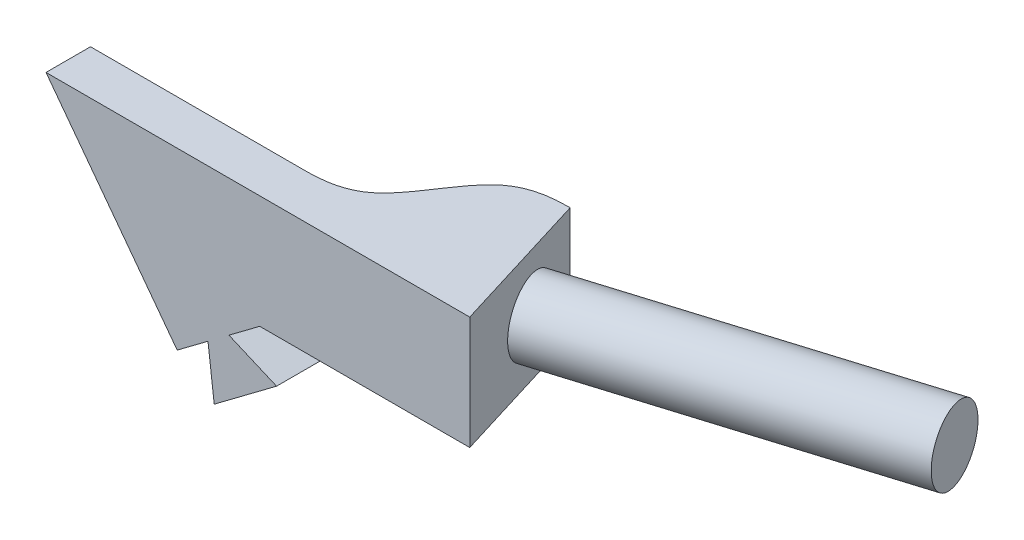
ISO-10303-21;
HEADER;
FILE_DESCRIPTION(('STEP AP214'),'2;1');
FILE_NAME('part.step','',(''),(''),'','','');
FILE_SCHEMA(('AUTOMOTIVE_DESIGN { 1 0 10303 214 1 1 1 1 }'));
ENDSEC;
DATA;
#1=APPLICATION_CONTEXT('core data for automotive mechanical design processes');
#2=APPLICATION_PROTOCOL_DEFINITION('international standard','automotive_design',2000,#1);
#3=PRODUCT_CONTEXT('',#1,'mechanical');
#4=PRODUCT('Part','Part','',(#3));
#5=PRODUCT_RELATED_PRODUCT_CATEGORY('part','',(#4));
#6=PRODUCT_DEFINITION_FORMATION('','',#4);
#7=PRODUCT_DEFINITION_CONTEXT('part definition',#1,'design');
#8=PRODUCT_DEFINITION('design','',#6,#7);
#9=PRODUCT_DEFINITION_SHAPE('','',#8);
#10=(LENGTH_UNIT() NAMED_UNIT(*) SI_UNIT(.MILLI.,.METRE.));
#11=(NAMED_UNIT(*) PLANE_ANGLE_UNIT() SI_UNIT($,.RADIAN.));
#12=(NAMED_UNIT(*) SI_UNIT($,.STERADIAN.) SOLID_ANGLE_UNIT());
#13=UNCERTAINTY_MEASURE_WITH_UNIT(LENGTH_MEASURE(1.E-05),#10,'distance_accuracy_value','');
#14=(GEOMETRIC_REPRESENTATION_CONTEXT(3) GLOBAL_UNCERTAINTY_ASSIGNED_CONTEXT((#13)) GLOBAL_UNIT_ASSIGNED_CONTEXT((#10,
#11,#12)) REPRESENTATION_CONTEXT('',''));
#15=CARTESIAN_POINT('',(0.,0.,0.));
#16=DIRECTION('',(0.,0.,1.));
#17=DIRECTION('',(1.,0.,0.));
#18=AXIS2_PLACEMENT_3D('',#15,#16,#17);
#19=CARTESIAN_POINT('',(-38.1,-12.7,-19.878167));
#20=DIRECTION('',(0.,-1.,0.));
#21=DIRECTION('',(0.,0.,-1.));
#22=AXIS2_PLACEMENT_3D('',#19,#20,#21);
#23=PLANE('',#22);
#24=DIRECTION('',(1.,0.,0.));
#25=VECTOR('',#24,1.);
#26=CARTESIAN_POINT('',(-38.1,-12.7,12.7));
#27=LINE('',#26,#25);
#28=CARTESIAN_POINT('',(-9.10564613460168,-12.7,12.7));
#29=VERTEX_POINT('',#28);
#30=CARTESIAN_POINT('',(38.1,-12.7,12.7));
#31=VERTEX_POINT('',#30);
#32=EDGE_CURVE('E91',#29,#31,#27,.T.);
#33=ORIENTED_EDGE('',*,*,#32,.F.);
#34=DIRECTION('',(0.,0.,-1.));
#35=VECTOR('',#34,1.);
#36=CARTESIAN_POINT('',(-9.10564613460168,-12.7,44.8615757491108));
#37=LINE('',#36,#35);
#38=CARTESIAN_POINT('',(-9.10564613460168,-12.7,2.7));
#39=VERTEX_POINT('',#38);
#40=EDGE_CURVE('E199',#29,#39,#37,.T.);
#41=ORIENTED_EDGE('',*,*,#40,.T.);
#42=CARTESIAN_POINT('',(28.0956449744943,-12.7,-19.878167));
#43=CARTESIAN_POINT('',(23.2624762333461,-12.7,-19.878167));
#44=CARTESIAN_POINT('',(13.7597257234162,-12.7,-18.3882704900342));
#45=CARTESIAN_POINT('',(5.19295176017359,-12.7,1.21010349003423));
#46=CARTESIAN_POINT('',(-4.18514201423127,-12.7,2.7));
#47=CARTESIAN_POINT('',(-9.1056461346017,-12.7,2.7));
#48=B_SPLINE_CURVE_WITH_KNOTS('',3,(#42,#43,#44,#45,#46,#47),.UNSPECIFIED.,.F.,.F.,(4,1,1,4),
(0.,0.311689084079751,0.688310915920249,1.),.UNSPECIFIED.);
#49=CARTESIAN_POINT('',(28.0956449744943,-12.7,-19.878167));
#50=VERTEX_POINT('',#49);
#51=EDGE_CURVE('E239',#50,#39,#48,.T.);
#52=ORIENTED_EDGE('',*,*,#51,.F.);
#53=DIRECTION('',(0.29355783850351,0.,0.95594131381228));
#54=VECTOR('',#53,1.);
#55=CARTESIAN_POINT('',(31.2527609708644,-12.7,-9.59733910995651));
#56=LINE('',#55,#54);
#57=EDGE_CURVE('E106',#50,#31,#56,.T.);
#58=ORIENTED_EDGE('',*,*,#57,.T.);
#59=EDGE_LOOP('',(#33,#41,#52,#58));
#60=FACE_BOUND('',#59,.T.);
#61=ADVANCED_FACE('F87',(#60),#23,.T.);
#62=CARTESIAN_POINT('',(-38.1,12.7,-19.878167));
#63=DIRECTION('',(0.,1.,0.));
#64=DIRECTION('',(0.,0.,1.));
#65=AXIS2_PLACEMENT_3D('',#62,#63,#64);
#66=PLANE('',#65);
#67=DIRECTION('',(-1.,0.,0.));
#68=VECTOR('',#67,1.);
#69=CARTESIAN_POINT('',(-38.1,12.7,12.7));
#70=LINE('',#69,#68);
#71=CARTESIAN_POINT('',(38.1,12.7,12.7));
#72=VERTEX_POINT('',#71);
#73=CARTESIAN_POINT('',(-57.1506044956256,12.7,12.7));
#74=VERTEX_POINT('',#73);
#75=EDGE_CURVE('E282',#72,#74,#70,.T.);
#76=ORIENTED_EDGE('',*,*,#75,.F.);
#77=DIRECTION('',(0.29355783850351,0.,0.95594131381228));
#78=VECTOR('',#77,1.);
#79=CARTESIAN_POINT('',(31.2527609708644,12.7,-9.59733910995651));
#80=LINE('',#79,#78);
#81=CARTESIAN_POINT('',(28.0956449744943,12.7,-19.878167));
#82=VERTEX_POINT('',#81);
#83=EDGE_CURVE('E235',#82,#72,#80,.T.);
#84=ORIENTED_EDGE('',*,*,#83,.F.);
#85=CARTESIAN_POINT('',(28.0956449744943,12.7,-19.878167));
#86=CARTESIAN_POINT('',(23.2624762333461,12.7,-19.878167));
#87=CARTESIAN_POINT('',(13.7597257234162,12.7,-18.3882704900342));
#88=CARTESIAN_POINT('',(5.19295176017359,12.7,1.21010349003423));
#89=CARTESIAN_POINT('',(-4.18514201423127,12.7,2.7));
#90=CARTESIAN_POINT('',(-9.1056461346017,12.7,2.7));
#91=B_SPLINE_CURVE_WITH_KNOTS('',3,(#85,#86,#87,#88,#89,#90),.UNSPECIFIED.,.F.,.F.,(4,1,1,4),
(0.,0.311689084079751,0.688310915920249,1.),.UNSPECIFIED.);
#92=CARTESIAN_POINT('',(-9.10564613460168,12.7,2.7));
#93=VERTEX_POINT('',#92);
#94=EDGE_CURVE('E247',#82,#93,#91,.T.);
#95=ORIENTED_EDGE('',*,*,#94,.T.);
#96=DIRECTION('',(-1.,0.,0.));
#97=VECTOR('',#96,1.);
#98=CARTESIAN_POINT('',(-9.10564613460168,12.7,2.7));
#99=LINE('',#98,#97);
#100=CARTESIAN_POINT('',(-57.1506044956256,12.7,2.69999999999999));
#101=VERTEX_POINT('',#100);
#102=EDGE_CURVE('E254',#93,#101,#99,.T.);
#103=ORIENTED_EDGE('',*,*,#102,.T.);
#104=DIRECTION('',(0.,0.,-1.));
#105=VECTOR('',#104,1.);
#106=CARTESIAN_POINT('',(-57.1506044956256,12.7,44.8615757491108));
#107=LINE('',#106,#105);
#108=EDGE_CURVE('E167',#74,#101,#107,.T.);
#109=ORIENTED_EDGE('',*,*,#108,.F.);
#110=EDGE_LOOP('',(#76,#84,#95,#103,#109));
#111=FACE_BOUND('',#110,.T.);
#112=ADVANCED_FACE('F89',(#111),#66,.T.);
#113=CARTESIAN_POINT('',(0.,0.,12.7));
#114=DIRECTION('',(0.,0.,-1.));
#115=DIRECTION('',(-1.,0.,0.));
#116=AXIS2_PLACEMENT_3D('',#113,#114,#115);
#117=PLANE('',#116);
#118=DIRECTION('',(0.,1.,0.));
#119=VECTOR('',#118,1.);
#120=CARTESIAN_POINT('',(38.1,-12.7,12.7));
#121=LINE('',#120,#119);
#122=EDGE_CURVE('E245',#31,#72,#121,.T.);
#123=ORIENTED_EDGE('',*,*,#122,.T.);
#124=ORIENTED_EDGE('',*,*,#75,.T.);
#125=DIRECTION('',(0.60001218489988,-0.799990861180097,0.));
#126=VECTOR('',#125,1.);
#127=CARTESIAN_POINT('',(-30.4794970600816,-22.8603481778424,12.7));
#128=LINE('',#127,#126);
#129=CARTESIAN_POINT('',(-27.6616086521931,-26.6174135022947,12.7));
#130=VERTEX_POINT('',#129);
#131=EDGE_CURVE('E227',#74,#130,#128,.T.);
#132=ORIENTED_EDGE('',*,*,#131,.T.);
#133=DIRECTION('',(0.799990861180097,0.60001218489988,0.));
#134=VECTOR('',#133,1.);
#135=CARTESIAN_POINT('',(2.81788840788857,-3.75706532445229,12.7));
#136=LINE('',#135,#134);
#137=CARTESIAN_POINT('',(-20.7364927995103,-21.4234118016709,12.7));
#138=VERTEX_POINT('',#137);
#139=EDGE_CURVE('E183',#130,#138,#136,.T.);
#140=ORIENTED_EDGE('',*,*,#139,.T.);
#141=DIRECTION('',(0.119630364113448,-0.992818501027295,0.));
#142=VECTOR('',#141,1.);
#143=CARTESIAN_POINT('',(-19.3435444398251,-32.9835613733929,12.7));
#144=LINE('',#143,#142);
#145=CARTESIAN_POINT('',(-19.3435444398251,-32.9835613733929,12.7));
#146=VERTEX_POINT('',#145);
#147=EDGE_CURVE('E200',#138,#146,#144,.T.);
#148=ORIENTED_EDGE('',*,*,#147,.T.);
#149=DIRECTION('',(0.799990861180097,0.600012184899879,0.));
#150=VECTOR('',#149,1.);
#151=CARTESIAN_POINT('',(-5.32290460678278,-22.4677478208376,12.7));
#152=LINE('',#151,#150);
#153=CARTESIAN_POINT('',(-5.32290460678277,-22.4677478208376,12.7));
#154=VERTEX_POINT('',#153);
#155=EDGE_CURVE('E203',#146,#154,#152,.T.);
#156=ORIENTED_EDGE('',*,*,#155,.T.);
#157=DIRECTION('',(-0.919621225293552,0.39280631612741,0.));
#158=VECTOR('',#157,1.);
#159=CARTESIAN_POINT('',(-16.0307619872844,-17.8940017006239,12.7));
#160=LINE('',#159,#158);
#161=CARTESIAN_POINT('',(-16.0307619872844,-17.8940017006239,12.7));
#162=VERTEX_POINT('',#161);
#163=EDGE_CURVE('E204',#154,#162,#160,.T.);
#164=ORIENTED_EDGE('',*,*,#163,.T.);
#165=EDGE_CURVE('E208',#162,#29,#136,.T.);
#166=ORIENTED_EDGE('',*,*,#165,.T.);
#167=ORIENTED_EDGE('',*,*,#32,.T.);
#168=EDGE_LOOP('',(#123,#124,#132,#140,#148,#156,#164,#166,#167));
#169=FACE_BOUND('',#168,.T.);
#170=ADVANCED_FACE('F264',(#169),#117,.F.);
#171=DIRECTION('',(0.,-1.,0.));
#172=VECTOR('',#171,1.);
#173=SURFACE_OF_LINEAR_EXTRUSION('',#91,#172);
#174=ORIENTED_EDGE('',*,*,#51,.T.);
#175=DIRECTION('',(0.,-1.,0.));
#176=VECTOR('',#175,1.);
#177=CARTESIAN_POINT('',(-9.10564613460168,12.7,2.7));
#178=LINE('',#177,#176);
#179=EDGE_CURVE('E246',#93,#39,#178,.T.);
#180=ORIENTED_EDGE('',*,*,#179,.F.);
#181=ORIENTED_EDGE('',*,*,#94,.F.);
#182=DIRECTION('',(0.,-1.,0.));
#183=VECTOR('',#182,1.);
#184=CARTESIAN_POINT('',(28.0956449744943,12.7,-19.878167));
#185=LINE('',#184,#183);
#186=EDGE_CURVE('E242',#82,#50,#185,.T.);
#187=ORIENTED_EDGE('',*,*,#186,.T.);
#188=EDGE_LOOP('',(#174,#180,#181,#187));
#189=FACE_BOUND('',#188,.T.);
#190=ADVANCED_FACE('F260',(#189),#173,.F.);
#191=CARTESIAN_POINT('',(-9.10564613460168,12.7,2.7));
#192=DIRECTION('',(0.,0.,1.));
#193=DIRECTION('',(1.,0.,0.));
#194=AXIS2_PLACEMENT_3D('',#191,#192,#193);
#195=PLANE('',#194);
#196=ORIENTED_EDGE('',*,*,#179,.T.);
#197=DIRECTION('',(-0.799990861180097,-0.60001218489988,0.));
#198=VECTOR('',#197,1.);
#199=CARTESIAN_POINT('',(2.81788840788857,-3.75706532445229,2.7));
#200=LINE('',#199,#198);
#201=CARTESIAN_POINT('',(-16.0307619872844,-17.8940017006239,2.7));
#202=VERTEX_POINT('',#201);
#203=EDGE_CURVE('E185',#39,#202,#200,.T.);
#204=ORIENTED_EDGE('',*,*,#203,.T.);
#205=DIRECTION('',(0.919621225293551,-0.39280631612741,0.));
#206=VECTOR('',#205,1.);
#207=CARTESIAN_POINT('',(-16.0307619872844,-17.8940017006239,2.7));
#208=LINE('',#207,#206);
#209=CARTESIAN_POINT('',(-5.32290460678277,-22.4677478208376,2.7));
#210=VERTEX_POINT('',#209);
#211=EDGE_CURVE('E195',#202,#210,#208,.T.);
#212=ORIENTED_EDGE('',*,*,#211,.T.);
#213=DIRECTION('',(-0.799990861180097,-0.600012184899879,0.));
#214=VECTOR('',#213,1.);
#215=CARTESIAN_POINT('',(-5.32290460678277,-22.4677478208376,2.7));
#216=LINE('',#215,#214);
#217=CARTESIAN_POINT('',(-19.3435444398251,-32.9835613733929,2.7));
#218=VERTEX_POINT('',#217);
#219=EDGE_CURVE('E212',#210,#218,#216,.T.);
#220=ORIENTED_EDGE('',*,*,#219,.T.);
#221=DIRECTION('',(-0.119630364113448,0.992818501027294,0.));
#222=VECTOR('',#221,1.);
#223=CARTESIAN_POINT('',(-19.3435444398251,-32.9835613733929,2.7));
#224=LINE('',#223,#222);
#225=CARTESIAN_POINT('',(-20.7364927995103,-21.4234118016709,2.7));
#226=VERTEX_POINT('',#225);
#227=EDGE_CURVE('E180',#218,#226,#224,.T.);
#228=ORIENTED_EDGE('',*,*,#227,.T.);
#229=CARTESIAN_POINT('',(-27.6616086521931,-26.6174135022947,2.7));
#230=VERTEX_POINT('',#229);
#231=EDGE_CURVE('E175',#226,#230,#200,.T.);
#232=ORIENTED_EDGE('',*,*,#231,.T.);
#233=DIRECTION('',(-0.60001218489988,0.799990861180097,0.));
#234=VECTOR('',#233,1.);
#235=CARTESIAN_POINT('',(-30.4794970600816,-22.8603481778424,2.7));
#236=LINE('',#235,#234);
#237=EDGE_CURVE('E160',#230,#101,#236,.T.);
#238=ORIENTED_EDGE('',*,*,#237,.T.);
#239=ORIENTED_EDGE('',*,*,#102,.F.);
#240=EDGE_LOOP('',(#196,#204,#212,#220,#228,#232,#238,#239));
#241=FACE_BOUND('',#240,.T.);
#242=ADVANCED_FACE('F177',(#241),#195,.F.);
#243=CARTESIAN_POINT('',(31.2527609708644,12.7,-9.59733910995651));
#244=DIRECTION('',(0.95594131381228,0.,-0.29355783850351));
#245=DIRECTION('',(-0.29355783850351,0.,-0.95594131381228));
#246=AXIS2_PLACEMENT_3D('',#243,#244,#245);
#247=PLANE('',#246);
#248=CARTESIAN_POINT('',(31.9956602155559,0.,-7.17816310150516));
#249=DIRECTION('',(0.95594131381228,0.,-0.293557838503509));
#250=DIRECTION('',(-0.293557838503509,0.,-0.95594131381228));
#251=AXIS2_PLACEMENT_3D('',#248,#249,#250);
#252=CIRCLE('',#251,7.9375);
#253=CARTESIAN_POINT('',(29.6655448724343,0.,-14.7659472798901));
#254=VERTEX_POINT('',#253);
#255=EDGE_CURVE('E12',#254,#254,#252,.T.);
#256=ORIENTED_EDGE('',*,*,#255,.F.);
#257=EDGE_LOOP('',(#256));
#258=FACE_BOUND('',#257,.T.);
#259=ORIENTED_EDGE('',*,*,#57,.F.);
#260=ORIENTED_EDGE('',*,*,#186,.F.);
#261=ORIENTED_EDGE('',*,*,#83,.T.);
#262=ORIENTED_EDGE('',*,*,#122,.F.);
#263=EDGE_LOOP('',(#259,#260,#261,#262));
#264=FACE_BOUND('',#263,.T.);
#265=ADVANCED_FACE('F266',(#258,#264),#247,.T.);
#266=CARTESIAN_POINT('',(104.838388328052,0.,-29.5472703954725));
#267=DIRECTION('',(-0.95594131381228,0.,0.293557838503509));
#268=DIRECTION('',(0.293557838503509,0.,0.95594131381228));
#269=AXIS2_PLACEMENT_3D('',#266,#267,#268);
#270=CYLINDRICAL_SURFACE('',#269,7.9375);
#271=CARTESIAN_POINT('',(104.838388328052,0.,-29.5472703954725));
#272=DIRECTION('',(0.95594131381228,0.,-0.293557838503509));
#273=DIRECTION('',(-0.293557838503509,0.,-0.95594131381228));
#274=AXIS2_PLACEMENT_3D('',#271,#272,#273);
#275=CIRCLE('',#274,7.9375);
#276=CARTESIAN_POINT('',(102.50827298493,0.,-37.1350545738575));
#277=VERTEX_POINT('',#276);
#278=EDGE_CURVE('E229',#277,#277,#275,.T.);
#279=ORIENTED_EDGE('',*,*,#278,.F.);
#280=EDGE_LOOP('',(#279));
#281=FACE_BOUND('',#280,.T.);
#282=ORIENTED_EDGE('',*,*,#255,.T.);
#283=EDGE_LOOP('',(#282));
#284=FACE_BOUND('',#283,.T.);
#285=ADVANCED_FACE('F305',(#281,#284),#270,.T.);
#286=CARTESIAN_POINT('',(104.838388328052,0.,-29.5472703954725));
#287=DIRECTION('',(0.95594131381228,0.,-0.293557838503509));
#288=DIRECTION('',(-0.293557838503509,0.,-0.95594131381228));
#289=AXIS2_PLACEMENT_3D('',#286,#287,#288);
#290=PLANE('',#289);
#291=ORIENTED_EDGE('',*,*,#278,.T.);
#292=EDGE_LOOP('',(#291));
#293=FACE_BOUND('',#292,.T.);
#294=ADVANCED_FACE('F311',(#293),#290,.T.);
#295=CARTESIAN_POINT('',(-30.4794970600816,-22.8603481778424,44.8615757491108));
#296=DIRECTION('',(-0.799990861180097,-0.60001218489988,0.));
#297=DIRECTION('',(0.60001218489988,-0.799990861180097,0.));
#298=AXIS2_PLACEMENT_3D('',#295,#296,#297);
#299=PLANE('',#298);
#300=ORIENTED_EDGE('',*,*,#131,.F.);
#301=ORIENTED_EDGE('',*,*,#108,.T.);
#302=ORIENTED_EDGE('',*,*,#237,.F.);
#303=DIRECTION('',(0.,0.,-1.));
#304=VECTOR('',#303,1.);
#305=CARTESIAN_POINT('',(-27.6616086521931,-26.6174135022947,44.8615757491108));
#306=LINE('',#305,#304);
#307=EDGE_CURVE('E165',#130,#230,#306,.T.);
#308=ORIENTED_EDGE('',*,*,#307,.F.);
#309=EDGE_LOOP('',(#300,#301,#302,#308));
#310=FACE_BOUND('',#309,.T.);
#311=ADVANCED_FACE('F163',(#310),#299,.T.);
#312=CARTESIAN_POINT('',(2.81788840788857,-3.75706532445229,44.8615757491108));
#313=DIRECTION('',(0.60001218489988,-0.799990861180097,0.));
#314=DIRECTION('',(0.799990861180097,0.60001218489988,0.));
#315=AXIS2_PLACEMENT_3D('',#312,#313,#314);
#316=PLANE('',#315);
#317=ORIENTED_EDGE('',*,*,#165,.F.);
#318=DIRECTION('',(0.,0.,-1.));
#319=VECTOR('',#318,1.);
#320=CARTESIAN_POINT('',(-16.0307619872844,-17.8940017006239,44.8615757491108));
#321=LINE('',#320,#319);
#322=EDGE_CURVE('E190',#162,#202,#321,.T.);
#323=ORIENTED_EDGE('',*,*,#322,.T.);
#324=ORIENTED_EDGE('',*,*,#203,.F.);
#325=ORIENTED_EDGE('',*,*,#40,.F.);
#326=EDGE_LOOP('',(#317,#323,#324,#325));
#327=FACE_BOUND('',#326,.T.);
#328=ADVANCED_FACE('F300',(#327),#316,.T.);
#329=DIRECTION('',(0.,0.,-1.));
#330=VECTOR('',#329,1.);
#331=CARTESIAN_POINT('',(-20.7364927995103,-21.4234118016709,44.8615757491108));
#332=LINE('',#331,#330);
#333=EDGE_CURVE('E171',#138,#226,#332,.T.);
#334=ORIENTED_EDGE('',*,*,#333,.F.);
#335=ORIENTED_EDGE('',*,*,#139,.F.);
#336=ORIENTED_EDGE('',*,*,#307,.T.);
#337=ORIENTED_EDGE('',*,*,#231,.F.);
#338=EDGE_LOOP('',(#334,#335,#336,#337));
#339=FACE_BOUND('',#338,.T.);
#340=ADVANCED_FACE('F187',(#339),#316,.T.);
#341=CARTESIAN_POINT('',(-5.32290460678278,-22.4677478208376,44.8615757491108));
#342=DIRECTION('',(0.600012184899879,-0.799990861180097,0.));
#343=DIRECTION('',(0.799990861180097,0.600012184899879,0.));
#344=AXIS2_PLACEMENT_3D('',#341,#342,#343);
#345=PLANE('',#344);
#346=ORIENTED_EDGE('',*,*,#155,.F.);
#347=DIRECTION('',(0.,0.,-1.));
#348=VECTOR('',#347,1.);
#349=CARTESIAN_POINT('',(-19.3435444398251,-32.9835613733929,44.8615757491108));
#350=LINE('',#349,#348);
#351=EDGE_CURVE('E220',#146,#218,#350,.T.);
#352=ORIENTED_EDGE('',*,*,#351,.T.);
#353=ORIENTED_EDGE('',*,*,#219,.F.);
#354=DIRECTION('',(0.,0.,-1.));
#355=VECTOR('',#354,1.);
#356=CARTESIAN_POINT('',(-5.32290460678278,-22.4677478208376,44.8615757491108));
#357=LINE('',#356,#355);
#358=EDGE_CURVE('E219',#154,#210,#357,.T.);
#359=ORIENTED_EDGE('',*,*,#358,.F.);
#360=EDGE_LOOP('',(#346,#352,#353,#359));
#361=FACE_BOUND('',#360,.T.);
#362=ADVANCED_FACE('F325',(#361),#345,.T.);
#363=CARTESIAN_POINT('',(-16.0307619872844,-17.8940017006239,44.8615757491108));
#364=DIRECTION('',(0.39280631612741,0.919621225293552,0.));
#365=DIRECTION('',(-0.919621225293552,0.39280631612741,0.));
#366=AXIS2_PLACEMENT_3D('',#363,#364,#365);
#367=PLANE('',#366);
#368=ORIENTED_EDGE('',*,*,#163,.F.);
#369=ORIENTED_EDGE('',*,*,#358,.T.);
#370=ORIENTED_EDGE('',*,*,#211,.F.);
#371=ORIENTED_EDGE('',*,*,#322,.F.);
#372=EDGE_LOOP('',(#368,#369,#370,#371));
#373=FACE_BOUND('',#372,.T.);
#374=ADVANCED_FACE('F321',(#373),#367,.T.);
#375=CARTESIAN_POINT('',(-19.3435444398251,-32.9835613733929,44.8615757491108));
#376=DIRECTION('',(-0.992818501027294,-0.119630364113448,0.));
#377=DIRECTION('',(0.119630364113448,-0.992818501027295,0.));
#378=AXIS2_PLACEMENT_3D('',#375,#376,#377);
#379=PLANE('',#378);
#380=ORIENTED_EDGE('',*,*,#147,.F.);
#381=ORIENTED_EDGE('',*,*,#333,.T.);
#382=ORIENTED_EDGE('',*,*,#227,.F.);
#383=ORIENTED_EDGE('',*,*,#351,.F.);
#384=EDGE_LOOP('',(#380,#381,#382,#383));
#385=FACE_BOUND('',#384,.T.);
#386=ADVANCED_FACE('F324',(#385),#379,.T.);
#387=CLOSED_SHELL('',(#61,#112,#170,#190,#242,#265,#285,#294,#311,#328,#340,#362,#374,#386));
#388=MANIFOLD_SOLID_BREP('B2',#387);
#389=ADVANCED_BREP_SHAPE_REPRESENTATION('',(#18,#388),#14);
#390=SHAPE_DEFINITION_REPRESENTATION(#9,#389);
ENDSEC;
END-ISO-10303-21;
